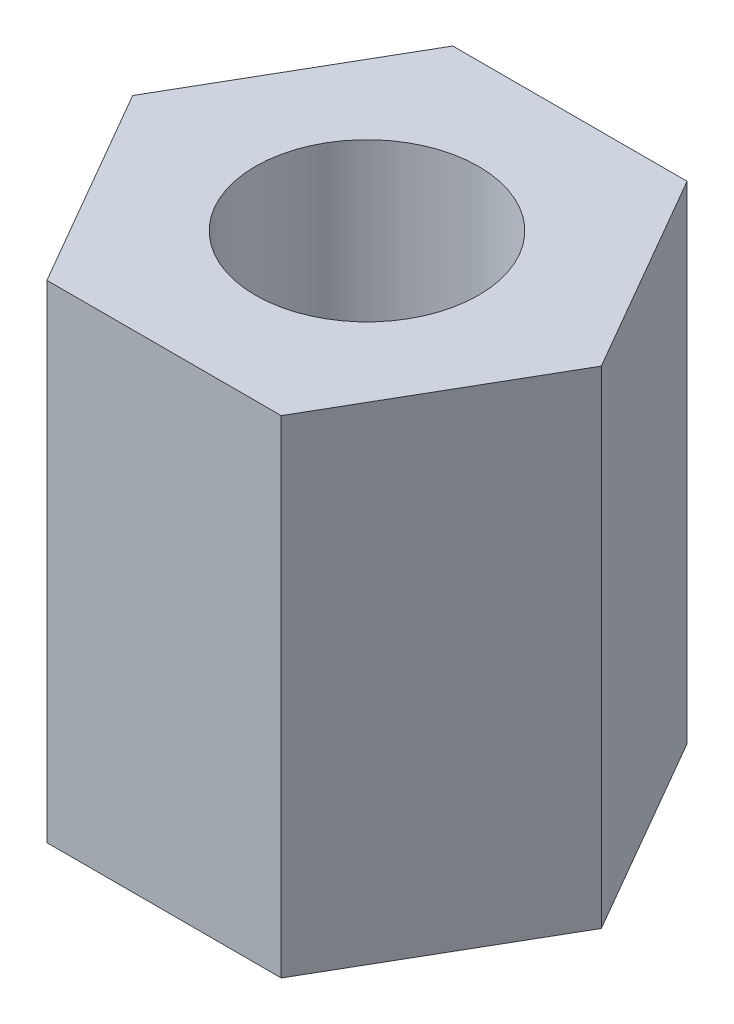
ISO-10303-21;
HEADER;
FILE_DESCRIPTION(('STEP AP214'),'2;1');
FILE_NAME('part.step','',(''),(''),'','','');
FILE_SCHEMA(('AUTOMOTIVE_DESIGN { 1 0 10303 214 1 1 1 1 }'));
ENDSEC;
DATA;
#1=APPLICATION_CONTEXT('core data for automotive mechanical design processes');
#2=APPLICATION_PROTOCOL_DEFINITION('international standard','automotive_design',2000,#1);
#3=PRODUCT_CONTEXT('',#1,'mechanical');
#4=PRODUCT('Part','Part','',(#3));
#5=PRODUCT_RELATED_PRODUCT_CATEGORY('part','',(#4));
#6=PRODUCT_DEFINITION_FORMATION('','',#4);
#7=PRODUCT_DEFINITION_CONTEXT('part definition',#1,'design');
#8=PRODUCT_DEFINITION('design','',#6,#7);
#9=PRODUCT_DEFINITION_SHAPE('','',#8);
#10=(LENGTH_UNIT() NAMED_UNIT(*) SI_UNIT(.MILLI.,.METRE.));
#11=(NAMED_UNIT(*) PLANE_ANGLE_UNIT() SI_UNIT($,.RADIAN.));
#12=(NAMED_UNIT(*) SI_UNIT($,.STERADIAN.) SOLID_ANGLE_UNIT());
#13=UNCERTAINTY_MEASURE_WITH_UNIT(LENGTH_MEASURE(1.E-05),#10,'distance_accuracy_value','');
#14=(GEOMETRIC_REPRESENTATION_CONTEXT(3) GLOBAL_UNCERTAINTY_ASSIGNED_CONTEXT((#13)) GLOBAL_UNIT_ASSIGNED_CONTEXT((#10,
#11,#12)) REPRESENTATION_CONTEXT('',''));
#15=CARTESIAN_POINT('',(0.,0.,0.));
#16=DIRECTION('',(0.,0.,1.));
#17=DIRECTION('',(1.,0.,0.));
#18=AXIS2_PLACEMENT_3D('',#15,#16,#17);
#19=CARTESIAN_POINT('',(0.,3.,0.));
#20=DIRECTION('',(0.,1.,0.));
#21=DIRECTION('',(0.,0.,1.));
#22=AXIS2_PLACEMENT_3D('',#19,#20,#21);
#23=PLANE('',#22);
#24=DIRECTION('',(0.5,0.,-0.866025403784439));
#25=VECTOR('',#24,1.);
#26=CARTESIAN_POINT('',(1.44337567297407,3.,2.5));
#27=LINE('',#26,#25);
#28=CARTESIAN_POINT('',(1.44337567297407,3.,2.5));
#29=VERTEX_POINT('',#28);
#30=CARTESIAN_POINT('',(2.88675134594813,3.,0.));
#31=VERTEX_POINT('',#30);
#32=EDGE_CURVE('E133',#29,#31,#27,.T.);
#33=ORIENTED_EDGE('',*,*,#32,.T.);
#34=DIRECTION('',(-0.5,0.,-0.866025403784438));
#35=VECTOR('',#34,1.);
#36=CARTESIAN_POINT('',(2.88675134594813,3.,0.));
#37=LINE('',#36,#35);
#38=CARTESIAN_POINT('',(1.44337567297406,3.,-2.5));
#39=VERTEX_POINT('',#38);
#40=EDGE_CURVE('E91',#31,#39,#37,.T.);
#41=ORIENTED_EDGE('',*,*,#40,.T.);
#42=DIRECTION('',(-1.,0.,0.));
#43=VECTOR('',#42,1.);
#44=CARTESIAN_POINT('',(1.44337567297406,3.,-2.5));
#45=LINE('',#44,#43);
#46=CARTESIAN_POINT('',(-1.44337567297406,3.,-2.5));
#47=VERTEX_POINT('',#46);
#48=EDGE_CURVE('E104',#39,#47,#45,.T.);
#49=ORIENTED_EDGE('',*,*,#48,.T.);
#50=DIRECTION('',(-0.5,0.,0.866025403784439));
#51=VECTOR('',#50,1.);
#52=CARTESIAN_POINT('',(-1.44337567297406,3.,-2.5));
#53=LINE('',#52,#51);
#54=CARTESIAN_POINT('',(-2.88675134594813,3.,0.));
#55=VERTEX_POINT('',#54);
#56=EDGE_CURVE('E98',#47,#55,#53,.T.);
#57=ORIENTED_EDGE('',*,*,#56,.T.);
#58=DIRECTION('',(0.5,0.,0.866025403784438));
#59=VECTOR('',#58,1.);
#60=CARTESIAN_POINT('',(-2.88675134594813,3.,0.));
#61=LINE('',#60,#59);
#62=CARTESIAN_POINT('',(-1.44337567297406,3.,2.5));
#63=VERTEX_POINT('',#62);
#64=EDGE_CURVE('E102',#55,#63,#61,.T.);
#65=ORIENTED_EDGE('',*,*,#64,.T.);
#66=DIRECTION('',(1.,0.,0.));
#67=VECTOR('',#66,1.);
#68=CARTESIAN_POINT('',(-1.44337567297406,3.,2.5));
#69=LINE('',#68,#67);
#70=EDGE_CURVE('E54',#63,#29,#69,.T.);
#71=ORIENTED_EDGE('',*,*,#70,.T.);
#72=EDGE_LOOP('',(#33,#41,#49,#57,#65,#71));
#73=FACE_BOUND('',#72,.T.);
#74=CARTESIAN_POINT('',(0.,3.,0.));
#75=DIRECTION('',(0.,1.,0.));
#76=DIRECTION('',(0.,0.,1.));
#77=AXIS2_PLACEMENT_3D('',#74,#75,#76);
#78=CIRCLE('',#77,1.375);
#79=CARTESIAN_POINT('',(0.,3.,1.375));
#80=VERTEX_POINT('',#79);
#81=EDGE_CURVE('E126',#80,#80,#78,.T.);
#82=ORIENTED_EDGE('',*,*,#81,.F.);
#83=EDGE_LOOP('',(#82));
#84=FACE_BOUND('',#83,.T.);
#85=ADVANCED_FACE('F37',(#73,#84),#23,.T.);
#86=CARTESIAN_POINT('',(0.,-3.,0.));
#87=DIRECTION('',(0.,1.,0.));
#88=DIRECTION('',(0.,0.,1.));
#89=AXIS2_PLACEMENT_3D('',#86,#87,#88);
#90=PLANE('',#89);
#91=DIRECTION('',(0.5,0.,-0.866025403784439));
#92=VECTOR('',#91,1.);
#93=CARTESIAN_POINT('',(1.44337567297407,-3.,2.5));
#94=LINE('',#93,#92);
#95=CARTESIAN_POINT('',(1.44337567297407,-3.,2.5));
#96=VERTEX_POINT('',#95);
#97=CARTESIAN_POINT('',(2.88675134594813,-3.,0.));
#98=VERTEX_POINT('',#97);
#99=EDGE_CURVE('E122',#96,#98,#94,.T.);
#100=ORIENTED_EDGE('',*,*,#99,.F.);
#101=DIRECTION('',(1.,0.,0.));
#102=VECTOR('',#101,1.);
#103=CARTESIAN_POINT('',(-1.44337567297406,-3.,2.5));
#104=LINE('',#103,#102);
#105=CARTESIAN_POINT('',(-1.44337567297406,-3.,2.5));
#106=VERTEX_POINT('',#105);
#107=EDGE_CURVE('E83',#106,#96,#104,.T.);
#108=ORIENTED_EDGE('',*,*,#107,.F.);
#109=DIRECTION('',(0.5,0.,0.866025403784438));
#110=VECTOR('',#109,1.);
#111=CARTESIAN_POINT('',(-2.88675134594813,-3.,0.));
#112=LINE('',#111,#110);
#113=CARTESIAN_POINT('',(-2.88675134594813,-3.,0.));
#114=VERTEX_POINT('',#113);
#115=EDGE_CURVE('E77',#114,#106,#112,.T.);
#116=ORIENTED_EDGE('',*,*,#115,.F.);
#117=DIRECTION('',(-0.5,0.,0.866025403784439));
#118=VECTOR('',#117,1.);
#119=CARTESIAN_POINT('',(-1.44337567297406,-3.,-2.5));
#120=LINE('',#119,#118);
#121=CARTESIAN_POINT('',(-1.44337567297406,-3.,-2.5));
#122=VERTEX_POINT('',#121);
#123=EDGE_CURVE('E112',#122,#114,#120,.T.);
#124=ORIENTED_EDGE('',*,*,#123,.F.);
#125=DIRECTION('',(-1.,0.,0.));
#126=VECTOR('',#125,1.);
#127=CARTESIAN_POINT('',(1.44337567297406,-3.,-2.5));
#128=LINE('',#127,#126);
#129=CARTESIAN_POINT('',(1.44337567297406,-3.,-2.5));
#130=VERTEX_POINT('',#129);
#131=EDGE_CURVE('E128',#130,#122,#128,.T.);
#132=ORIENTED_EDGE('',*,*,#131,.F.);
#133=DIRECTION('',(-0.5,0.,-0.866025403784438));
#134=VECTOR('',#133,1.);
#135=CARTESIAN_POINT('',(2.88675134594813,-3.,0.));
#136=LINE('',#135,#134);
#137=EDGE_CURVE('E125',#98,#130,#136,.T.);
#138=ORIENTED_EDGE('',*,*,#137,.F.);
#139=EDGE_LOOP('',(#100,#108,#116,#124,#132,#138));
#140=FACE_BOUND('',#139,.T.);
#141=CARTESIAN_POINT('',(0.,-3.,0.));
#142=DIRECTION('',(0.,1.,0.));
#143=DIRECTION('',(0.,0.,1.));
#144=AXIS2_PLACEMENT_3D('',#141,#142,#143);
#145=CIRCLE('',#144,1.375);
#146=CARTESIAN_POINT('',(0.,-3.,1.375));
#147=VERTEX_POINT('',#146);
#148=EDGE_CURVE('E226',#147,#147,#145,.T.);
#149=ORIENTED_EDGE('',*,*,#148,.T.);
#150=EDGE_LOOP('',(#149));
#151=FACE_BOUND('',#150,.T.);
#152=ADVANCED_FACE('F142',(#140,#151),#90,.F.);
#153=CARTESIAN_POINT('',(1.44337567297407,3.,2.5));
#154=DIRECTION('',(-0.866025403784439,0.,-0.5));
#155=DIRECTION('',(-0.5,0.,0.866025403784439));
#156=AXIS2_PLACEMENT_3D('',#153,#154,#155);
#157=PLANE('',#156);
#158=ORIENTED_EDGE('',*,*,#99,.T.);
#159=DIRECTION('',(0.,-1.,0.));
#160=VECTOR('',#159,1.);
#161=CARTESIAN_POINT('',(2.88675134594813,3.,0.));
#162=LINE('',#161,#160);
#163=EDGE_CURVE('E11',#31,#98,#162,.T.);
#164=ORIENTED_EDGE('',*,*,#163,.F.);
#165=ORIENTED_EDGE('',*,*,#32,.F.);
#166=DIRECTION('',(0.,-1.,0.));
#167=VECTOR('',#166,1.);
#168=CARTESIAN_POINT('',(1.44337567297407,3.,2.5));
#169=LINE('',#168,#167);
#170=EDGE_CURVE('E118',#29,#96,#169,.T.);
#171=ORIENTED_EDGE('',*,*,#170,.T.);
#172=EDGE_LOOP('',(#158,#164,#165,#171));
#173=FACE_BOUND('',#172,.T.);
#174=ADVANCED_FACE('F39',(#173),#157,.F.);
#175=CARTESIAN_POINT('',(2.88675134594813,3.,0.));
#176=DIRECTION('',(-0.866025403784438,0.,0.5));
#177=DIRECTION('',(0.5,0.,0.866025403784438));
#178=AXIS2_PLACEMENT_3D('',#175,#176,#177);
#179=PLANE('',#178);
#180=ORIENTED_EDGE('',*,*,#137,.T.);
#181=DIRECTION('',(0.,-1.,0.));
#182=VECTOR('',#181,1.);
#183=CARTESIAN_POINT('',(1.44337567297406,3.,-2.5));
#184=LINE('',#183,#182);
#185=EDGE_CURVE('E46',#39,#130,#184,.T.);
#186=ORIENTED_EDGE('',*,*,#185,.F.);
#187=ORIENTED_EDGE('',*,*,#40,.F.);
#188=ORIENTED_EDGE('',*,*,#163,.T.);
#189=EDGE_LOOP('',(#180,#186,#187,#188));
#190=FACE_BOUND('',#189,.T.);
#191=ADVANCED_FACE('F167',(#190),#179,.F.);
#192=CARTESIAN_POINT('',(1.44337567297406,3.,-2.5));
#193=DIRECTION('',(0.,0.,1.));
#194=DIRECTION('',(1.,0.,0.));
#195=AXIS2_PLACEMENT_3D('',#192,#193,#194);
#196=PLANE('',#195);
#197=ORIENTED_EDGE('',*,*,#131,.T.);
#198=DIRECTION('',(0.,-1.,0.));
#199=VECTOR('',#198,1.);
#200=CARTESIAN_POINT('',(-1.44337567297406,3.,-2.5));
#201=LINE('',#200,#199);
#202=EDGE_CURVE('E113',#47,#122,#201,.T.);
#203=ORIENTED_EDGE('',*,*,#202,.F.);
#204=ORIENTED_EDGE('',*,*,#48,.F.);
#205=ORIENTED_EDGE('',*,*,#185,.T.);
#206=EDGE_LOOP('',(#197,#203,#204,#205));
#207=FACE_BOUND('',#206,.T.);
#208=ADVANCED_FACE('F139',(#207),#196,.F.);
#209=CARTESIAN_POINT('',(-1.44337567297406,3.,-2.5));
#210=DIRECTION('',(0.866025403784438,0.,0.5));
#211=DIRECTION('',(0.5,0.,-0.866025403784439));
#212=AXIS2_PLACEMENT_3D('',#209,#210,#211);
#213=PLANE('',#212);
#214=ORIENTED_EDGE('',*,*,#123,.T.);
#215=DIRECTION('',(0.,-1.,0.));
#216=VECTOR('',#215,1.);
#217=CARTESIAN_POINT('',(-2.88675134594813,3.,0.));
#218=LINE('',#217,#216);
#219=EDGE_CURVE('E109',#55,#114,#218,.T.);
#220=ORIENTED_EDGE('',*,*,#219,.F.);
#221=ORIENTED_EDGE('',*,*,#56,.F.);
#222=ORIENTED_EDGE('',*,*,#202,.T.);
#223=EDGE_LOOP('',(#214,#220,#221,#222));
#224=FACE_BOUND('',#223,.T.);
#225=ADVANCED_FACE('F110',(#224),#213,.F.);
#226=CARTESIAN_POINT('',(-2.88675134594813,3.,0.));
#227=DIRECTION('',(0.866025403784438,0.,-0.5));
#228=DIRECTION('',(-0.5,0.,-0.866025403784439));
#229=AXIS2_PLACEMENT_3D('',#226,#227,#228);
#230=PLANE('',#229);
#231=ORIENTED_EDGE('',*,*,#115,.T.);
#232=DIRECTION('',(0.,-1.,0.));
#233=VECTOR('',#232,1.);
#234=CARTESIAN_POINT('',(-1.44337567297406,3.,2.5));
#235=LINE('',#234,#233);
#236=EDGE_CURVE('E114',#63,#106,#235,.T.);
#237=ORIENTED_EDGE('',*,*,#236,.F.);
#238=ORIENTED_EDGE('',*,*,#64,.F.);
#239=ORIENTED_EDGE('',*,*,#219,.T.);
#240=EDGE_LOOP('',(#231,#237,#238,#239));
#241=FACE_BOUND('',#240,.T.);
#242=ADVANCED_FACE('F116',(#241),#230,.F.);
#243=CARTESIAN_POINT('',(-1.44337567297406,3.,2.5));
#244=DIRECTION('',(0.,0.,-1.));
#245=DIRECTION('',(-1.,0.,0.));
#246=AXIS2_PLACEMENT_3D('',#243,#244,#245);
#247=PLANE('',#246);
#248=ORIENTED_EDGE('',*,*,#107,.T.);
#249=ORIENTED_EDGE('',*,*,#170,.F.);
#250=ORIENTED_EDGE('',*,*,#70,.F.);
#251=ORIENTED_EDGE('',*,*,#236,.T.);
#252=EDGE_LOOP('',(#248,#249,#250,#251));
#253=FACE_BOUND('',#252,.T.);
#254=ADVANCED_FACE('F147',(#253),#247,.F.);
#255=CARTESIAN_POINT('',(0.,3.,0.));
#256=DIRECTION('',(0.,-1.,0.));
#257=DIRECTION('',(0.,0.,-1.));
#258=AXIS2_PLACEMENT_3D('',#255,#256,#257);
#259=CYLINDRICAL_SURFACE('',#258,1.375);
#260=ORIENTED_EDGE('',*,*,#81,.T.);
#261=EDGE_LOOP('',(#260));
#262=FACE_BOUND('',#261,.T.);
#263=ORIENTED_EDGE('',*,*,#148,.F.);
#264=EDGE_LOOP('',(#263));
#265=FACE_BOUND('',#264,.T.);
#266=ADVANCED_FACE('F149',(#262,#265),#259,.F.);
#267=CLOSED_SHELL('',(#85,#152,#174,#191,#208,#225,#242,#254,#266));
#268=MANIFOLD_SOLID_BREP('B2',#267);
#269=ADVANCED_BREP_SHAPE_REPRESENTATION('',(#18,#268),#14);
#270=SHAPE_DEFINITION_REPRESENTATION(#9,#269);
ENDSEC;
END-ISO-10303-21;
